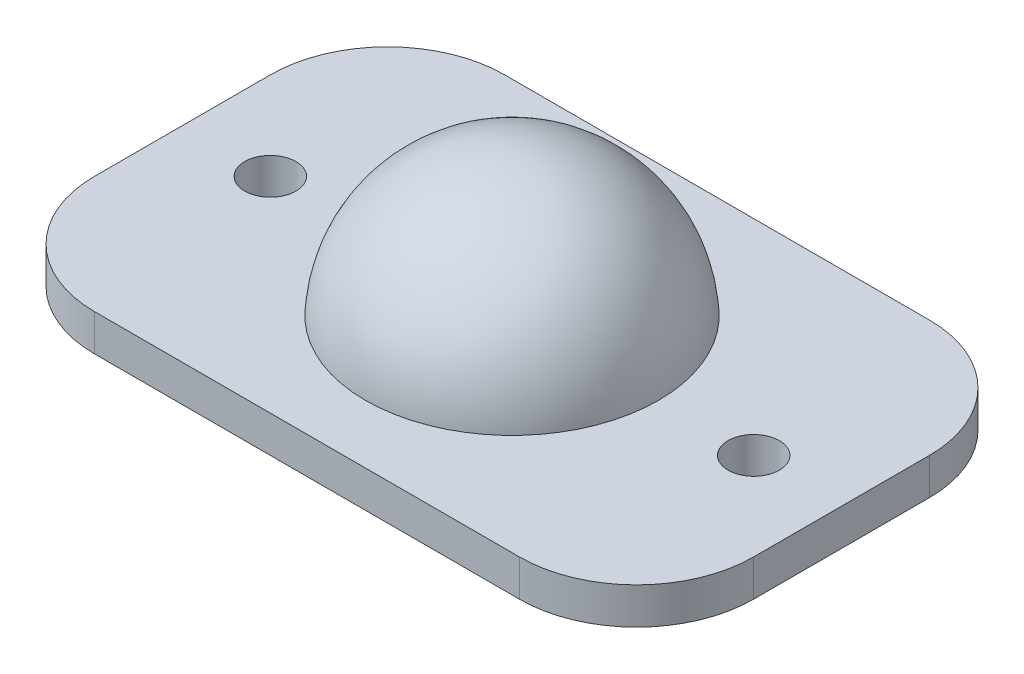
ISO-10303-21;
HEADER;
FILE_DESCRIPTION(('STEP AP214'),'2;1');
FILE_NAME('part.step','',(''),(''),'','','');
FILE_SCHEMA(('AUTOMOTIVE_DESIGN { 1 0 10303 214 1 1 1 1 }'));
ENDSEC;
DATA;
#1=APPLICATION_CONTEXT('core data for automotive mechanical design processes');
#2=APPLICATION_PROTOCOL_DEFINITION('international standard','automotive_design',2000,#1);
#3=PRODUCT_CONTEXT('',#1,'mechanical');
#4=PRODUCT('Part','Part','',(#3));
#5=PRODUCT_RELATED_PRODUCT_CATEGORY('part','',(#4));
#6=PRODUCT_DEFINITION_FORMATION('','',#4);
#7=PRODUCT_DEFINITION_CONTEXT('part definition',#1,'design');
#8=PRODUCT_DEFINITION('design','',#6,#7);
#9=PRODUCT_DEFINITION_SHAPE('','',#8);
#10=(LENGTH_UNIT() NAMED_UNIT(*) SI_UNIT(.MILLI.,.METRE.));
#11=(NAMED_UNIT(*) PLANE_ANGLE_UNIT() SI_UNIT($,.RADIAN.));
#12=(NAMED_UNIT(*) SI_UNIT($,.STERADIAN.) SOLID_ANGLE_UNIT());
#13=UNCERTAINTY_MEASURE_WITH_UNIT(LENGTH_MEASURE(1.E-05),#10,'distance_accuracy_value','');
#14=(GEOMETRIC_REPRESENTATION_CONTEXT(3) GLOBAL_UNCERTAINTY_ASSIGNED_CONTEXT((#13)) GLOBAL_UNIT_ASSIGNED_CONTEXT((#10,
#11,#12)) REPRESENTATION_CONTEXT('',''));
#15=CARTESIAN_POINT('',(0.,0.,0.));
#16=DIRECTION('',(0.,0.,1.));
#17=DIRECTION('',(1.,0.,0.));
#18=AXIS2_PLACEMENT_3D('',#15,#16,#17);
#19=CARTESIAN_POINT('',(-14.5,1.25,-6.));
#20=DIRECTION('',(0.,-1.,0.));
#21=DIRECTION('',(0.,0.,-1.));
#22=AXIS2_PLACEMENT_3D('',#19,#20,#21);
#23=PLANE('',#22);
#24=CARTESIAN_POINT('',(0.,1.25,0.));
#25=DIRECTION('',(0.,1.,0.));
#26=DIRECTION('',(0.,0.,1.));
#27=AXIS2_PLACEMENT_3D('',#24,#25,#26);
#28=CIRCLE('',#27,10.);
#29=CARTESIAN_POINT('',(0.,1.25,10.));
#30=VERTEX_POINT('',#29);
#31=EDGE_CURVE('E42',#30,#30,#28,.T.);
#32=ORIENTED_EDGE('',*,*,#31,.F.);
#33=EDGE_LOOP('',(#32));
#34=FACE_BOUND('',#33,.T.);
#35=CARTESIAN_POINT('',(-14.5,1.25,-6.));
#36=DIRECTION('',(0.,1.,0.));
#37=DIRECTION('',(0.,0.,-1.));
#38=AXIS2_PLACEMENT_3D('',#35,#36,#37);
#39=CIRCLE('',#38,8.);
#40=CARTESIAN_POINT('',(-14.4999999999999,1.25,-14.));
#41=VERTEX_POINT('',#40);
#42=CARTESIAN_POINT('',(-22.5,1.25,-5.99999999999994));
#43=VERTEX_POINT('',#42);
#44=EDGE_CURVE('E146',#41,#43,#39,.T.);
#45=ORIENTED_EDGE('',*,*,#44,.T.);
#46=DIRECTION('',(0.,0.,1.));
#47=VECTOR('',#46,1.);
#48=CARTESIAN_POINT('',(-22.5,1.25,5.99999999999994));
#49=LINE('',#48,#47);
#50=CARTESIAN_POINT('',(-22.5,1.25,5.99999999999994));
#51=VERTEX_POINT('',#50);
#52=EDGE_CURVE('E94',#43,#51,#49,.T.);
#53=ORIENTED_EDGE('',*,*,#52,.T.);
#54=CARTESIAN_POINT('',(-14.5,1.25,6.));
#55=DIRECTION('',(0.,1.,0.));
#56=DIRECTION('',(0.,0.,-1.));
#57=AXIS2_PLACEMENT_3D('',#54,#55,#56);
#58=CIRCLE('',#57,8.);
#59=CARTESIAN_POINT('',(-14.4999999999999,1.25,14.));
#60=VERTEX_POINT('',#59);
#61=EDGE_CURVE('E178',#51,#60,#58,.T.);
#62=ORIENTED_EDGE('',*,*,#61,.T.);
#63=DIRECTION('',(1.,0.,0.));
#64=VECTOR('',#63,1.);
#65=CARTESIAN_POINT('',(-14.4999999999999,1.25,14.));
#66=LINE('',#65,#64);
#67=CARTESIAN_POINT('',(14.4999999999999,1.25,14.));
#68=VERTEX_POINT('',#67);
#69=EDGE_CURVE('E180',#60,#68,#66,.T.);
#70=ORIENTED_EDGE('',*,*,#69,.T.);
#71=CARTESIAN_POINT('',(14.5,1.25,6.));
#72=DIRECTION('',(0.,1.,0.));
#73=DIRECTION('',(0.,0.,1.));
#74=AXIS2_PLACEMENT_3D('',#71,#72,#73);
#75=CIRCLE('',#74,8.);
#76=CARTESIAN_POINT('',(22.5,1.25,5.99999999999994));
#77=VERTEX_POINT('',#76);
#78=EDGE_CURVE('E113',#68,#77,#75,.T.);
#79=ORIENTED_EDGE('',*,*,#78,.T.);
#80=DIRECTION('',(0.,0.,-1.));
#81=VECTOR('',#80,1.);
#82=CARTESIAN_POINT('',(22.5,1.25,5.99999999999994));
#83=LINE('',#82,#81);
#84=CARTESIAN_POINT('',(22.5,1.25,-5.99999999999994));
#85=VERTEX_POINT('',#84);
#86=EDGE_CURVE('E107',#77,#85,#83,.T.);
#87=ORIENTED_EDGE('',*,*,#86,.T.);
#88=CARTESIAN_POINT('',(14.5,1.25,-6.));
#89=DIRECTION('',(0.,1.,0.));
#90=DIRECTION('',(0.,0.,-1.));
#91=AXIS2_PLACEMENT_3D('',#88,#89,#90);
#92=CIRCLE('',#91,8.);
#93=CARTESIAN_POINT('',(14.4999999999999,1.25,-14.));
#94=VERTEX_POINT('',#93);
#95=EDGE_CURVE('E111',#85,#94,#92,.T.);
#96=ORIENTED_EDGE('',*,*,#95,.T.);
#97=DIRECTION('',(-1.,0.,0.));
#98=VECTOR('',#97,1.);
#99=CARTESIAN_POINT('',(-14.4999999999999,1.25,-14.));
#100=LINE('',#99,#98);
#101=EDGE_CURVE('E50',#94,#41,#100,.T.);
#102=ORIENTED_EDGE('',*,*,#101,.T.);
#103=EDGE_LOOP('',(#45,#53,#62,#70,#79,#87,#96,#102));
#104=FACE_BOUND('',#103,.T.);
#105=CARTESIAN_POINT('',(16.5,1.25,0.));
#106=DIRECTION('',(0.,1.,0.));
#107=DIRECTION('',(0.,0.,1.));
#108=AXIS2_PLACEMENT_3D('',#105,#106,#107);
#109=CIRCLE('',#108,1.75);
#110=CARTESIAN_POINT('',(16.5,1.25,1.75));
#111=VERTEX_POINT('',#110);
#112=EDGE_CURVE('E135',#111,#111,#109,.T.);
#113=ORIENTED_EDGE('',*,*,#112,.F.);
#114=EDGE_LOOP('',(#113));
#115=FACE_BOUND('',#114,.T.);
#116=CARTESIAN_POINT('',(-16.5,1.25,0.));
#117=DIRECTION('',(0.,1.,0.));
#118=DIRECTION('',(0.,0.,1.));
#119=AXIS2_PLACEMENT_3D('',#116,#117,#118);
#120=CIRCLE('',#119,1.75);
#121=CARTESIAN_POINT('',(-16.5,1.25,1.75));
#122=VERTEX_POINT('',#121);
#123=EDGE_CURVE('E165',#122,#122,#120,.T.);
#124=ORIENTED_EDGE('',*,*,#123,.F.);
#125=EDGE_LOOP('',(#124));
#126=FACE_BOUND('',#125,.T.);
#127=ADVANCED_FACE('F33',(#34,#104,#115,#126),#23,.F.);
#128=CARTESIAN_POINT('',(-14.5,-1.25,-6.));
#129=DIRECTION('',(0.,-1.,0.));
#130=DIRECTION('',(0.,0.,-1.));
#131=AXIS2_PLACEMENT_3D('',#128,#129,#130);
#132=PLANE('',#131);
#133=CARTESIAN_POINT('',(16.5,-1.25,0.));
#134=DIRECTION('',(0.,1.,0.));
#135=DIRECTION('',(0.,0.,1.));
#136=AXIS2_PLACEMENT_3D('',#133,#134,#135);
#137=CIRCLE('',#136,1.75);
#138=CARTESIAN_POINT('',(16.5,-1.25,1.75));
#139=VERTEX_POINT('',#138);
#140=EDGE_CURVE('E168',#139,#139,#137,.T.);
#141=ORIENTED_EDGE('',*,*,#140,.T.);
#142=EDGE_LOOP('',(#141));
#143=FACE_BOUND('',#142,.T.);
#144=CARTESIAN_POINT('',(-14.5,-1.25,-6.));
#145=DIRECTION('',(0.,1.,0.));
#146=DIRECTION('',(0.,0.,-1.));
#147=AXIS2_PLACEMENT_3D('',#144,#145,#146);
#148=CIRCLE('',#147,8.);
#149=CARTESIAN_POINT('',(-14.4999999999999,-1.25,-14.));
#150=VERTEX_POINT('',#149);
#151=CARTESIAN_POINT('',(-22.5,-1.25,-5.99999999999994));
#152=VERTEX_POINT('',#151);
#153=EDGE_CURVE('E131',#150,#152,#148,.T.);
#154=ORIENTED_EDGE('',*,*,#153,.F.);
#155=DIRECTION('',(-1.,0.,0.));
#156=VECTOR('',#155,1.);
#157=CARTESIAN_POINT('',(-14.4999999999999,-1.25,-14.));
#158=LINE('',#157,#156);
#159=CARTESIAN_POINT('',(14.4999999999999,-1.25,-14.));
#160=VERTEX_POINT('',#159);
#161=EDGE_CURVE('E85',#160,#150,#158,.T.);
#162=ORIENTED_EDGE('',*,*,#161,.F.);
#163=CARTESIAN_POINT('',(14.5,-1.25,-6.));
#164=DIRECTION('',(0.,1.,0.));
#165=DIRECTION('',(0.,0.,-1.));
#166=AXIS2_PLACEMENT_3D('',#163,#164,#165);
#167=CIRCLE('',#166,8.);
#168=CARTESIAN_POINT('',(22.5,-1.25,-5.99999999999994));
#169=VERTEX_POINT('',#168);
#170=EDGE_CURVE('E79',#169,#160,#167,.T.);
#171=ORIENTED_EDGE('',*,*,#170,.F.);
#172=DIRECTION('',(0.,0.,-1.));
#173=VECTOR('',#172,1.);
#174=CARTESIAN_POINT('',(22.5,-1.25,5.99999999999994));
#175=LINE('',#174,#173);
#176=CARTESIAN_POINT('',(22.5,-1.25,5.99999999999994));
#177=VERTEX_POINT('',#176);
#178=EDGE_CURVE('E121',#177,#169,#175,.T.);
#179=ORIENTED_EDGE('',*,*,#178,.F.);
#180=CARTESIAN_POINT('',(14.5,-1.25,6.));
#181=DIRECTION('',(0.,1.,0.));
#182=DIRECTION('',(0.,0.,1.));
#183=AXIS2_PLACEMENT_3D('',#180,#181,#182);
#184=CIRCLE('',#183,8.);
#185=CARTESIAN_POINT('',(14.4999999999999,-1.25,14.));
#186=VERTEX_POINT('',#185);
#187=EDGE_CURVE('E141',#186,#177,#184,.T.);
#188=ORIENTED_EDGE('',*,*,#187,.F.);
#189=DIRECTION('',(1.,0.,0.));
#190=VECTOR('',#189,1.);
#191=CARTESIAN_POINT('',(-14.4999999999999,-1.25,14.));
#192=LINE('',#191,#190);
#193=CARTESIAN_POINT('',(-14.4999999999999,-1.25,14.));
#194=VERTEX_POINT('',#193);
#195=EDGE_CURVE('E139',#194,#186,#192,.T.);
#196=ORIENTED_EDGE('',*,*,#195,.F.);
#197=CARTESIAN_POINT('',(-14.5,-1.25,6.));
#198=DIRECTION('',(0.,1.,0.));
#199=DIRECTION('',(0.,0.,-1.));
#200=AXIS2_PLACEMENT_3D('',#197,#198,#199);
#201=CIRCLE('',#200,8.);
#202=CARTESIAN_POINT('',(-22.5,-1.25,5.99999999999994));
#203=VERTEX_POINT('',#202);
#204=EDGE_CURVE('E137',#203,#194,#201,.T.);
#205=ORIENTED_EDGE('',*,*,#204,.F.);
#206=DIRECTION('',(0.,0.,1.));
#207=VECTOR('',#206,1.);
#208=CARTESIAN_POINT('',(-22.5,-1.25,5.99999999999994));
#209=LINE('',#208,#207);
#210=EDGE_CURVE('E134',#152,#203,#209,.T.);
#211=ORIENTED_EDGE('',*,*,#210,.F.);
#212=EDGE_LOOP('',(#154,#162,#171,#179,#188,#196,#205,#211));
#213=FACE_BOUND('',#212,.T.);
#214=CARTESIAN_POINT('',(-16.5,-1.25,0.));
#215=DIRECTION('',(0.,1.,0.));
#216=DIRECTION('',(0.,0.,1.));
#217=AXIS2_PLACEMENT_3D('',#214,#215,#216);
#218=CIRCLE('',#217,1.75);
#219=CARTESIAN_POINT('',(-16.5,-1.25,1.75));
#220=VERTEX_POINT('',#219);
#221=EDGE_CURVE('E169',#220,#220,#218,.T.);
#222=ORIENTED_EDGE('',*,*,#221,.T.);
#223=EDGE_LOOP('',(#222));
#224=FACE_BOUND('',#223,.T.);
#225=ADVANCED_FACE('F193',(#143,#213,#224),#132,.T.);
#226=CARTESIAN_POINT('',(-14.5,1.25,-6.));
#227=DIRECTION('',(0.,-1.,0.));
#228=DIRECTION('',(0.,0.,-1.));
#229=AXIS2_PLACEMENT_3D('',#226,#227,#228);
#230=CYLINDRICAL_SURFACE('',#229,8.);
#231=ORIENTED_EDGE('',*,*,#153,.T.);
#232=DIRECTION('',(0.,-1.,0.));
#233=VECTOR('',#232,1.);
#234=CARTESIAN_POINT('',(-22.5,1.25,-5.99999999999994));
#235=LINE('',#234,#233);
#236=EDGE_CURVE('E158',#43,#152,#235,.T.);
#237=ORIENTED_EDGE('',*,*,#236,.F.);
#238=ORIENTED_EDGE('',*,*,#44,.F.);
#239=DIRECTION('',(0.,-1.,0.));
#240=VECTOR('',#239,1.);
#241=CARTESIAN_POINT('',(-14.4999999999999,1.25,-14.));
#242=LINE('',#241,#240);
#243=EDGE_CURVE('E127',#41,#150,#242,.T.);
#244=ORIENTED_EDGE('',*,*,#243,.T.);
#245=EDGE_LOOP('',(#231,#237,#238,#244));
#246=FACE_BOUND('',#245,.T.);
#247=ADVANCED_FACE('F197',(#246),#230,.T.);
#248=CARTESIAN_POINT('',(-22.5,1.25,5.99999999999994));
#249=DIRECTION('',(1.,0.,0.));
#250=DIRECTION('',(0.,0.,-1.));
#251=AXIS2_PLACEMENT_3D('',#248,#249,#250);
#252=PLANE('',#251);
#253=ORIENTED_EDGE('',*,*,#210,.T.);
#254=DIRECTION('',(0.,-1.,0.));
#255=VECTOR('',#254,1.);
#256=CARTESIAN_POINT('',(-22.5,1.25,5.99999999999994));
#257=LINE('',#256,#255);
#258=EDGE_CURVE('E156',#51,#203,#257,.T.);
#259=ORIENTED_EDGE('',*,*,#258,.F.);
#260=ORIENTED_EDGE('',*,*,#52,.F.);
#261=ORIENTED_EDGE('',*,*,#236,.T.);
#262=EDGE_LOOP('',(#253,#259,#260,#261));
#263=FACE_BOUND('',#262,.T.);
#264=ADVANCED_FACE('F298',(#263),#252,.F.);
#265=CARTESIAN_POINT('',(-14.5,1.25,6.));
#266=DIRECTION('',(0.,-1.,0.));
#267=DIRECTION('',(0.,0.,-1.));
#268=AXIS2_PLACEMENT_3D('',#265,#266,#267);
#269=CYLINDRICAL_SURFACE('',#268,8.);
#270=ORIENTED_EDGE('',*,*,#204,.T.);
#271=DIRECTION('',(0.,-1.,0.));
#272=VECTOR('',#271,1.);
#273=CARTESIAN_POINT('',(-14.4999999999999,1.25,14.));
#274=LINE('',#273,#272);
#275=EDGE_CURVE('E153',#60,#194,#274,.T.);
#276=ORIENTED_EDGE('',*,*,#275,.F.);
#277=ORIENTED_EDGE('',*,*,#61,.F.);
#278=ORIENTED_EDGE('',*,*,#258,.T.);
#279=EDGE_LOOP('',(#270,#276,#277,#278));
#280=FACE_BOUND('',#279,.T.);
#281=ADVANCED_FACE('F289',(#280),#269,.T.);
#282=CARTESIAN_POINT('',(-14.4999999999999,1.25,14.));
#283=DIRECTION('',(0.,0.,-1.));
#284=DIRECTION('',(-1.,0.,0.));
#285=AXIS2_PLACEMENT_3D('',#282,#283,#284);
#286=PLANE('',#285);
#287=ORIENTED_EDGE('',*,*,#195,.T.);
#288=DIRECTION('',(0.,-1.,0.));
#289=VECTOR('',#288,1.);
#290=CARTESIAN_POINT('',(14.4999999999999,1.25,14.));
#291=LINE('',#290,#289);
#292=EDGE_CURVE('E150',#68,#186,#291,.T.);
#293=ORIENTED_EDGE('',*,*,#292,.F.);
#294=ORIENTED_EDGE('',*,*,#69,.F.);
#295=ORIENTED_EDGE('',*,*,#275,.T.);
#296=EDGE_LOOP('',(#287,#293,#294,#295));
#297=FACE_BOUND('',#296,.T.);
#298=ADVANCED_FACE('F186',(#297),#286,.F.);
#299=CARTESIAN_POINT('',(14.5,1.25,6.));
#300=DIRECTION('',(0.,-1.,0.));
#301=DIRECTION('',(0.,0.,-1.));
#302=AXIS2_PLACEMENT_3D('',#299,#300,#301);
#303=CYLINDRICAL_SURFACE('',#302,8.);
#304=ORIENTED_EDGE('',*,*,#187,.T.);
#305=DIRECTION('',(0.,-1.,0.));
#306=VECTOR('',#305,1.);
#307=CARTESIAN_POINT('',(22.5,1.25,5.99999999999994));
#308=LINE('',#307,#306);
#309=EDGE_CURVE('E122',#77,#177,#308,.T.);
#310=ORIENTED_EDGE('',*,*,#309,.F.);
#311=ORIENTED_EDGE('',*,*,#78,.F.);
#312=ORIENTED_EDGE('',*,*,#292,.T.);
#313=EDGE_LOOP('',(#304,#310,#311,#312));
#314=FACE_BOUND('',#313,.T.);
#315=ADVANCED_FACE('F190',(#314),#303,.T.);
#316=CARTESIAN_POINT('',(22.5,1.25,5.99999999999994));
#317=DIRECTION('',(-1.,0.,0.));
#318=DIRECTION('',(0.,0.,1.));
#319=AXIS2_PLACEMENT_3D('',#316,#317,#318);
#320=PLANE('',#319);
#321=ORIENTED_EDGE('',*,*,#178,.T.);
#322=DIRECTION('',(0.,-1.,0.));
#323=VECTOR('',#322,1.);
#324=CARTESIAN_POINT('',(22.5,1.25,-5.99999999999994));
#325=LINE('',#324,#323);
#326=EDGE_CURVE('E118',#85,#169,#325,.T.);
#327=ORIENTED_EDGE('',*,*,#326,.F.);
#328=ORIENTED_EDGE('',*,*,#86,.F.);
#329=ORIENTED_EDGE('',*,*,#309,.T.);
#330=EDGE_LOOP('',(#321,#327,#328,#329));
#331=FACE_BOUND('',#330,.T.);
#332=ADVANCED_FACE('F119',(#331),#320,.F.);
#333=CARTESIAN_POINT('',(14.5,1.25,-6.));
#334=DIRECTION('',(0.,-1.,0.));
#335=DIRECTION('',(0.,0.,-1.));
#336=AXIS2_PLACEMENT_3D('',#333,#334,#335);
#337=CYLINDRICAL_SURFACE('',#336,8.);
#338=ORIENTED_EDGE('',*,*,#170,.T.);
#339=DIRECTION('',(0.,-1.,0.));
#340=VECTOR('',#339,1.);
#341=CARTESIAN_POINT('',(14.4999999999999,1.25,-14.));
#342=LINE('',#341,#340);
#343=EDGE_CURVE('E123',#94,#160,#342,.T.);
#344=ORIENTED_EDGE('',*,*,#343,.F.);
#345=ORIENTED_EDGE('',*,*,#95,.F.);
#346=ORIENTED_EDGE('',*,*,#326,.T.);
#347=EDGE_LOOP('',(#338,#344,#345,#346));
#348=FACE_BOUND('',#347,.T.);
#349=ADVANCED_FACE('F125',(#348),#337,.T.);
#350=CARTESIAN_POINT('',(-14.4999999999999,1.25,-14.));
#351=DIRECTION('',(0.,0.,1.));
#352=DIRECTION('',(1.,0.,0.));
#353=AXIS2_PLACEMENT_3D('',#350,#351,#352);
#354=PLANE('',#353);
#355=ORIENTED_EDGE('',*,*,#161,.T.);
#356=ORIENTED_EDGE('',*,*,#243,.F.);
#357=ORIENTED_EDGE('',*,*,#101,.F.);
#358=ORIENTED_EDGE('',*,*,#343,.T.);
#359=EDGE_LOOP('',(#355,#356,#357,#358));
#360=FACE_BOUND('',#359,.T.);
#361=ADVANCED_FACE('F199',(#360),#354,.F.);
#362=CARTESIAN_POINT('',(16.5,1.25,0.));
#363=DIRECTION('',(0.,-1.,0.));
#364=DIRECTION('',(0.,0.,-1.));
#365=AXIS2_PLACEMENT_3D('',#362,#363,#364);
#366=CYLINDRICAL_SURFACE('',#365,1.75);
#367=ORIENTED_EDGE('',*,*,#112,.T.);
#368=EDGE_LOOP('',(#367));
#369=FACE_BOUND('',#368,.T.);
#370=ORIENTED_EDGE('',*,*,#140,.F.);
#371=EDGE_LOOP('',(#370));
#372=FACE_BOUND('',#371,.T.);
#373=ADVANCED_FACE('F201',(#369,#372),#366,.F.);
#374=CARTESIAN_POINT('',(-16.5,1.25,0.));
#375=DIRECTION('',(0.,-1.,0.));
#376=DIRECTION('',(0.,0.,-1.));
#377=AXIS2_PLACEMENT_3D('',#374,#375,#376);
#378=CYLINDRICAL_SURFACE('',#377,1.75);
#379=ORIENTED_EDGE('',*,*,#123,.T.);
#380=EDGE_LOOP('',(#379));
#381=FACE_BOUND('',#380,.T.);
#382=ORIENTED_EDGE('',*,*,#221,.F.);
#383=EDGE_LOOP('',(#382));
#384=FACE_BOUND('',#383,.T.);
#385=ADVANCED_FACE('F207',(#381,#384),#378,.F.);
#386=CARTESIAN_POINT('',(0.,10.75,0.));
#387=DIRECTION('',(0.,1.,0.));
#388=DIRECTION('',(0.,0.,1.));
#389=AXIS2_PLACEMENT_3D('',#386,#387,#388);
#390=PLANE('',#389);
#391=CARTESIAN_POINT('',(0.,10.75,0.));
#392=DIRECTION('',(0.,1.,0.));
#393=DIRECTION('',(0.,0.,1.));
#394=AXIS2_PLACEMENT_3D('',#391,#392,#393);
#395=CIRCLE('',#394,0.0125078222809102);
#396=CARTESIAN_POINT('',(0.,10.75,0.0125078222809102));
#397=VERTEX_POINT('',#396);
#398=EDGE_CURVE('E11',#397,#397,#395,.T.);
#399=ORIENTED_EDGE('',*,*,#398,.T.);
#400=EDGE_LOOP('',(#399));
#401=FACE_BOUND('',#400,.T.);
#402=ADVANCED_FACE('F222',(#401),#390,.T.);
#403=CARTESIAN_POINT('',(0.,0.749999999999999,0.));
#404=DIRECTION('',(0.,-1.,0.));
#405=DIRECTION('',(0.,0.,-1.));
#406=AXIS2_PLACEMENT_3D('',#403,#404,#405);
#407=DEGENERATE_TOROIDAL_SURFACE('',#406,0.0125078222809102,10.,.T.);
#408=ORIENTED_EDGE('',*,*,#31,.T.);
#409=EDGE_LOOP('',(#408));
#410=FACE_BOUND('',#409,.T.);
#411=ORIENTED_EDGE('',*,*,#398,.F.);
#412=EDGE_LOOP('',(#411));
#413=FACE_BOUND('',#412,.T.);
#414=ADVANCED_FACE('F35',(#410,#413),#407,.T.);
#415=CLOSED_SHELL('',(#127,#225,#247,#264,#281,#298,#315,#332,#349,#361,#373,#385,#402,#414));
#416=MANIFOLD_SOLID_BREP('B2',#415);
#417=ADVANCED_BREP_SHAPE_REPRESENTATION('',(#18,#416),#14);
#418=SHAPE_DEFINITION_REPRESENTATION(#9,#417);
ENDSEC;
END-ISO-10303-21;
